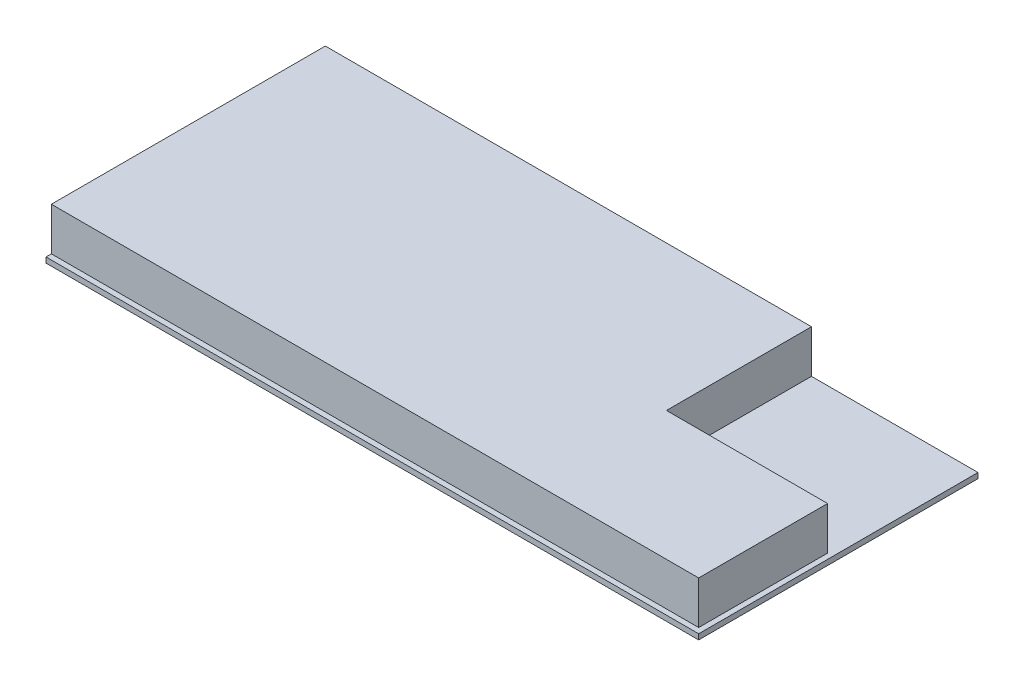
ISO-10303-21;
HEADER;
FILE_DESCRIPTION(('STEP AP214'),'2;1');
FILE_NAME('part.step','',(''),(''),'','','');
FILE_SCHEMA(('AUTOMOTIVE_DESIGN { 1 0 10303 214 1 1 1 1 }'));
ENDSEC;
DATA;
#1=APPLICATION_CONTEXT('core data for automotive mechanical design processes');
#2=APPLICATION_PROTOCOL_DEFINITION('international standard','automotive_design',2000,#1);
#3=PRODUCT_CONTEXT('',#1,'mechanical');
#4=PRODUCT('Part','Part','',(#3));
#5=PRODUCT_RELATED_PRODUCT_CATEGORY('part','',(#4));
#6=PRODUCT_DEFINITION_FORMATION('','',#4);
#7=PRODUCT_DEFINITION_CONTEXT('part definition',#1,'design');
#8=PRODUCT_DEFINITION('design','',#6,#7);
#9=PRODUCT_DEFINITION_SHAPE('','',#8);
#10=(LENGTH_UNIT() NAMED_UNIT(*) SI_UNIT(.MILLI.,.METRE.));
#11=(NAMED_UNIT(*) PLANE_ANGLE_UNIT() SI_UNIT($,.RADIAN.));
#12=(NAMED_UNIT(*) SI_UNIT($,.STERADIAN.) SOLID_ANGLE_UNIT());
#13=UNCERTAINTY_MEASURE_WITH_UNIT(LENGTH_MEASURE(1.E-05),#10,'distance_accuracy_value','');
#14=(GEOMETRIC_REPRESENTATION_CONTEXT(3) GLOBAL_UNCERTAINTY_ASSIGNED_CONTEXT((#13)) GLOBAL_UNIT_ASSIGNED_CONTEXT((#10,
#11,#12)) REPRESENTATION_CONTEXT('',''));
#15=CARTESIAN_POINT('',(0.,0.,0.));
#16=DIRECTION('',(0.,0.,1.));
#17=DIRECTION('',(1.,0.,0.));
#18=AXIS2_PLACEMENT_3D('',#15,#16,#17);
#19=CARTESIAN_POINT('',(0.,50.,0.));
#20=DIRECTION('',(0.,-1.,0.));
#21=DIRECTION('',(0.,0.,-1.));
#22=AXIS2_PLACEMENT_3D('',#19,#20,#21);
#23=PLANE('',#22);
#24=DIRECTION('',(1.,0.,0.));
#25=VECTOR('',#24,1.);
#26=CARTESIAN_POINT('',(0.,50.,1250.));
#27=LINE('',#26,#25);
#28=CARTESIAN_POINT('',(0.,50.,1250.));
#29=VERTEX_POINT('',#28);
#30=CARTESIAN_POINT('',(6025.,50.,1250.));
#31=VERTEX_POINT('',#30);
#32=EDGE_CURVE('E62',#29,#31,#27,.T.);
#33=ORIENTED_EDGE('',*,*,#32,.F.);
#34=DIRECTION('',(0.,0.,1.));
#35=VECTOR('',#34,1.);
#36=CARTESIAN_POINT('',(0.,50.,0.));
#37=LINE('',#36,#35);
#38=CARTESIAN_POINT('',(0.,50.,1300.));
#39=VERTEX_POINT('',#38);
#40=EDGE_CURVE('E174',#29,#39,#37,.T.);
#41=ORIENTED_EDGE('',*,*,#40,.T.);
#42=DIRECTION('',(1.,0.,0.));
#43=VECTOR('',#42,1.);
#44=CARTESIAN_POINT('',(-6075.,50.,1300.));
#45=LINE('',#44,#43);
#46=CARTESIAN_POINT('',(6075.,50.,1300.));
#47=VERTEX_POINT('',#46);
#48=EDGE_CURVE('E47',#39,#47,#45,.T.);
#49=ORIENTED_EDGE('',*,*,#48,.T.);
#50=DIRECTION('',(0.,0.,1.));
#51=VECTOR('',#50,1.);
#52=CARTESIAN_POINT('',(6075.,50.,1300.));
#53=LINE('',#52,#51);
#54=CARTESIAN_POINT('',(6075.,50.,-1300.));
#55=VERTEX_POINT('',#54);
#56=EDGE_CURVE('E150',#55,#47,#53,.T.);
#57=ORIENTED_EDGE('',*,*,#56,.F.);
#58=DIRECTION('',(1.,0.,0.));
#59=VECTOR('',#58,1.);
#60=CARTESIAN_POINT('',(6075.,50.,-1300.));
#61=LINE('',#60,#59);
#62=CARTESIAN_POINT('',(4525.,50.,-1300.));
#63=VERTEX_POINT('',#62);
#64=EDGE_CURVE('E149',#63,#55,#61,.T.);
#65=ORIENTED_EDGE('',*,*,#64,.F.);
#66=DIRECTION('',(0.,0.,1.));
#67=VECTOR('',#66,1.);
#68=CARTESIAN_POINT('',(4525.,50.,50.));
#69=LINE('',#68,#67);
#70=CARTESIAN_POINT('',(4525.,50.,50.));
#71=VERTEX_POINT('',#70);
#72=EDGE_CURVE('E168',#63,#71,#69,.T.);
#73=ORIENTED_EDGE('',*,*,#72,.T.);
#74=DIRECTION('',(1.,0.,0.));
#75=VECTOR('',#74,1.);
#76=CARTESIAN_POINT('',(6025.,50.,50.));
#77=LINE('',#76,#75);
#78=CARTESIAN_POINT('',(6025.,50.,50.));
#79=VERTEX_POINT('',#78);
#80=EDGE_CURVE('E170',#71,#79,#77,.T.);
#81=ORIENTED_EDGE('',*,*,#80,.T.);
#82=DIRECTION('',(0.,0.,1.));
#83=VECTOR('',#82,1.);
#84=CARTESIAN_POINT('',(6025.,50.,1250.));
#85=LINE('',#84,#83);
#86=EDGE_CURVE('E162',#79,#31,#85,.T.);
#87=ORIENTED_EDGE('',*,*,#86,.T.);
#88=EDGE_LOOP('',(#33,#41,#49,#57,#65,#73,#81,#87));
#89=FACE_BOUND('',#88,.T.);
#90=ADVANCED_FACE('F41',(#89),#23,.F.);
#91=CARTESIAN_POINT('',(-6075.,50.,-1300.));
#92=DIRECTION('',(0.,0.,1.));
#93=DIRECTION('',(1.,0.,0.));
#94=AXIS2_PLACEMENT_3D('',#91,#92,#93);
#95=PLANE('',#94);
#96=DIRECTION('',(-1.,0.,0.));
#97=VECTOR('',#96,1.);
#98=CARTESIAN_POINT('',(-6075.,0.,-1300.));
#99=LINE('',#98,#97);
#100=CARTESIAN_POINT('',(6075.,0.,-1300.));
#101=VERTEX_POINT('',#100);
#102=CARTESIAN_POINT('',(0.,0.,-1300.));
#103=VERTEX_POINT('',#102);
#104=EDGE_CURVE('E132',#101,#103,#99,.T.);
#105=ORIENTED_EDGE('',*,*,#104,.T.);
#106=DIRECTION('',(0.,1.,0.));
#107=VECTOR('',#106,1.);
#108=CARTESIAN_POINT('',(0.,0.,-1300.));
#109=LINE('',#108,#107);
#110=CARTESIAN_POINT('',(0.,450.,-1300.));
#111=VERTEX_POINT('',#110);
#112=EDGE_CURVE('E116',#103,#111,#109,.T.);
#113=ORIENTED_EDGE('',*,*,#112,.T.);
#114=DIRECTION('',(-1.,0.,0.));
#115=VECTOR('',#114,1.);
#116=CARTESIAN_POINT('',(-4525.,450.,-1300.));
#117=LINE('',#116,#115);
#118=CARTESIAN_POINT('',(4525.,450.,-1300.));
#119=VERTEX_POINT('',#118);
#120=EDGE_CURVE('E139',#119,#111,#117,.T.);
#121=ORIENTED_EDGE('',*,*,#120,.F.);
#122=DIRECTION('',(0.,-1.,0.));
#123=VECTOR('',#122,1.);
#124=CARTESIAN_POINT('',(4525.,450.,-1300.));
#125=LINE('',#124,#123);
#126=EDGE_CURVE('E147',#119,#63,#125,.T.);
#127=ORIENTED_EDGE('',*,*,#126,.T.);
#128=ORIENTED_EDGE('',*,*,#64,.T.);
#129=DIRECTION('',(0.,-1.,0.));
#130=VECTOR('',#129,1.);
#131=CARTESIAN_POINT('',(6075.,50.,-1300.));
#132=LINE('',#131,#130);
#133=EDGE_CURVE('E136',#55,#101,#132,.T.);
#134=ORIENTED_EDGE('',*,*,#133,.T.);
#135=EDGE_LOOP('',(#105,#113,#121,#127,#128,#134));
#136=FACE_BOUND('',#135,.T.);
#137=ADVANCED_FACE('F43',(#136),#95,.F.);
#138=CARTESIAN_POINT('',(-6075.,50.,1300.));
#139=DIRECTION('',(0.,0.,-1.));
#140=DIRECTION('',(-1.,0.,0.));
#141=AXIS2_PLACEMENT_3D('',#138,#139,#140);
#142=PLANE('',#141);
#143=ORIENTED_EDGE('',*,*,#48,.F.);
#144=DIRECTION('',(0.,1.,0.));
#145=VECTOR('',#144,1.);
#146=CARTESIAN_POINT('',(0.,0.,1300.));
#147=LINE('',#146,#145);
#148=CARTESIAN_POINT('',(0.,0.,1300.));
#149=VERTEX_POINT('',#148);
#150=EDGE_CURVE('E114',#149,#39,#147,.T.);
#151=ORIENTED_EDGE('',*,*,#150,.F.);
#152=DIRECTION('',(1.,0.,0.));
#153=VECTOR('',#152,1.);
#154=CARTESIAN_POINT('',(-6075.,0.,1300.));
#155=LINE('',#154,#153);
#156=CARTESIAN_POINT('',(6075.,0.,1300.));
#157=VERTEX_POINT('',#156);
#158=EDGE_CURVE('E123',#149,#157,#155,.T.);
#159=ORIENTED_EDGE('',*,*,#158,.T.);
#160=DIRECTION('',(0.,-1.,0.));
#161=VECTOR('',#160,1.);
#162=CARTESIAN_POINT('',(6075.,50.,1300.));
#163=LINE('',#162,#161);
#164=EDGE_CURVE('E144',#47,#157,#163,.T.);
#165=ORIENTED_EDGE('',*,*,#164,.F.);
#166=EDGE_LOOP('',(#143,#151,#159,#165));
#167=FACE_BOUND('',#166,.T.);
#168=ADVANCED_FACE('F124',(#167),#142,.F.);
#169=CARTESIAN_POINT('',(0.,0.,0.));
#170=DIRECTION('',(0.,-1.,0.));
#171=DIRECTION('',(0.,0.,-1.));
#172=AXIS2_PLACEMENT_3D('',#169,#170,#171);
#173=PLANE('',#172);
#174=DIRECTION('',(0.,0.,-1.));
#175=VECTOR('',#174,1.);
#176=CARTESIAN_POINT('',(0.,0.,-1300.));
#177=LINE('',#176,#175);
#178=EDGE_CURVE('E109',#149,#103,#177,.T.);
#179=ORIENTED_EDGE('',*,*,#178,.T.);
#180=ORIENTED_EDGE('',*,*,#104,.F.);
#181=DIRECTION('',(0.,0.,1.));
#182=VECTOR('',#181,1.);
#183=CARTESIAN_POINT('',(6075.,0.,1300.));
#184=LINE('',#183,#182);
#185=EDGE_CURVE('E131',#101,#157,#184,.T.);
#186=ORIENTED_EDGE('',*,*,#185,.T.);
#187=ORIENTED_EDGE('',*,*,#158,.F.);
#188=EDGE_LOOP('',(#179,#180,#186,#187));
#189=FACE_BOUND('',#188,.T.);
#190=ADVANCED_FACE('F129',(#189),#173,.T.);
#191=CARTESIAN_POINT('',(0.,450.,1250.));
#192=DIRECTION('',(0.,0.,-1.));
#193=DIRECTION('',(-1.,0.,0.));
#194=AXIS2_PLACEMENT_3D('',#191,#192,#193);
#195=PLANE('',#194);
#196=DIRECTION('',(1.,0.,0.));
#197=VECTOR('',#196,1.);
#198=CARTESIAN_POINT('',(0.,450.,1250.));
#199=LINE('',#198,#197);
#200=CARTESIAN_POINT('',(0.,450.,1250.));
#201=VERTEX_POINT('',#200);
#202=CARTESIAN_POINT('',(6025.,450.,1250.));
#203=VERTEX_POINT('',#202);
#204=EDGE_CURVE('E133',#201,#203,#199,.T.);
#205=ORIENTED_EDGE('',*,*,#204,.F.);
#206=DIRECTION('',(0.,-1.,0.));
#207=VECTOR('',#206,1.);
#208=CARTESIAN_POINT('',(0.,450.,1250.));
#209=LINE('',#208,#207);
#210=EDGE_CURVE('E57',#201,#29,#209,.T.);
#211=ORIENTED_EDGE('',*,*,#210,.T.);
#212=ORIENTED_EDGE('',*,*,#32,.T.);
#213=DIRECTION('',(0.,-1.,0.));
#214=VECTOR('',#213,1.);
#215=CARTESIAN_POINT('',(6025.,450.,1250.));
#216=LINE('',#215,#214);
#217=EDGE_CURVE('E159',#203,#31,#216,.T.);
#218=ORIENTED_EDGE('',*,*,#217,.F.);
#219=EDGE_LOOP('',(#205,#211,#212,#218));
#220=FACE_BOUND('',#219,.T.);
#221=ADVANCED_FACE('F206',(#220),#195,.F.);
#222=CARTESIAN_POINT('',(0.,450.,0.));
#223=DIRECTION('',(0.,-1.,0.));
#224=DIRECTION('',(0.,0.,-1.));
#225=AXIS2_PLACEMENT_3D('',#222,#223,#224);
#226=PLANE('',#225);
#227=ORIENTED_EDGE('',*,*,#120,.T.);
#228=DIRECTION('',(0.,0.,1.));
#229=VECTOR('',#228,1.);
#230=CARTESIAN_POINT('',(0.,450.,0.));
#231=LINE('',#230,#229);
#232=EDGE_CURVE('E11',#111,#201,#231,.T.);
#233=ORIENTED_EDGE('',*,*,#232,.T.);
#234=ORIENTED_EDGE('',*,*,#204,.T.);
#235=DIRECTION('',(0.,0.,1.));
#236=VECTOR('',#235,1.);
#237=CARTESIAN_POINT('',(6025.,450.,1250.));
#238=LINE('',#237,#236);
#239=CARTESIAN_POINT('',(6025.,450.,50.));
#240=VERTEX_POINT('',#239);
#241=EDGE_CURVE('E165',#240,#203,#238,.T.);
#242=ORIENTED_EDGE('',*,*,#241,.F.);
#243=DIRECTION('',(1.,0.,0.));
#244=VECTOR('',#243,1.);
#245=CARTESIAN_POINT('',(6025.,450.,50.));
#246=LINE('',#245,#244);
#247=CARTESIAN_POINT('',(4525.,450.,50.));
#248=VERTEX_POINT('',#247);
#249=EDGE_CURVE('E177',#248,#240,#246,.T.);
#250=ORIENTED_EDGE('',*,*,#249,.F.);
#251=DIRECTION('',(0.,0.,1.));
#252=VECTOR('',#251,1.);
#253=CARTESIAN_POINT('',(4525.,450.,50.));
#254=LINE('',#253,#252);
#255=EDGE_CURVE('E167',#119,#248,#254,.T.);
#256=ORIENTED_EDGE('',*,*,#255,.F.);
#257=EDGE_LOOP('',(#227,#233,#234,#242,#250,#256));
#258=FACE_BOUND('',#257,.T.);
#259=ADVANCED_FACE('F186',(#258),#226,.F.);
#260=CARTESIAN_POINT('',(6075.,50.,1300.));
#261=DIRECTION('',(-1.,0.,0.));
#262=DIRECTION('',(0.,0.,-1.));
#263=AXIS2_PLACEMENT_3D('',#260,#261,#262);
#264=PLANE('',#263);
#265=ORIENTED_EDGE('',*,*,#185,.F.);
#266=ORIENTED_EDGE('',*,*,#133,.F.);
#267=ORIENTED_EDGE('',*,*,#56,.T.);
#268=ORIENTED_EDGE('',*,*,#164,.T.);
#269=EDGE_LOOP('',(#265,#266,#267,#268));
#270=FACE_BOUND('',#269,.T.);
#271=ADVANCED_FACE('F197',(#270),#264,.F.);
#272=CARTESIAN_POINT('',(4525.,450.,50.));
#273=DIRECTION('',(-1.,0.,0.));
#274=DIRECTION('',(0.,0.,-1.));
#275=AXIS2_PLACEMENT_3D('',#272,#273,#274);
#276=PLANE('',#275);
#277=ORIENTED_EDGE('',*,*,#72,.F.);
#278=ORIENTED_EDGE('',*,*,#126,.F.);
#279=ORIENTED_EDGE('',*,*,#255,.T.);
#280=DIRECTION('',(0.,-1.,0.));
#281=VECTOR('',#280,1.);
#282=CARTESIAN_POINT('',(4525.,450.,50.));
#283=LINE('',#282,#281);
#284=EDGE_CURVE('E156',#248,#71,#283,.T.);
#285=ORIENTED_EDGE('',*,*,#284,.T.);
#286=EDGE_LOOP('',(#277,#278,#279,#285));
#287=FACE_BOUND('',#286,.T.);
#288=ADVANCED_FACE('F195',(#287),#276,.F.);
#289=CARTESIAN_POINT('',(6025.,450.,50.));
#290=DIRECTION('',(0.,0.,1.));
#291=DIRECTION('',(-1.,0.,0.));
#292=AXIS2_PLACEMENT_3D('',#289,#290,#291);
#293=PLANE('',#292);
#294=ORIENTED_EDGE('',*,*,#80,.F.);
#295=ORIENTED_EDGE('',*,*,#284,.F.);
#296=ORIENTED_EDGE('',*,*,#249,.T.);
#297=DIRECTION('',(0.,-1.,0.));
#298=VECTOR('',#297,1.);
#299=CARTESIAN_POINT('',(6025.,450.,50.));
#300=LINE('',#299,#298);
#301=EDGE_CURVE('E158',#240,#79,#300,.T.);
#302=ORIENTED_EDGE('',*,*,#301,.T.);
#303=EDGE_LOOP('',(#294,#295,#296,#302));
#304=FACE_BOUND('',#303,.T.);
#305=ADVANCED_FACE('F201',(#304),#293,.F.);
#306=CARTESIAN_POINT('',(6025.,450.,1250.));
#307=DIRECTION('',(-1.,0.,0.));
#308=DIRECTION('',(0.,0.,-1.));
#309=AXIS2_PLACEMENT_3D('',#306,#307,#308);
#310=PLANE('',#309);
#311=ORIENTED_EDGE('',*,*,#86,.F.);
#312=ORIENTED_EDGE('',*,*,#301,.F.);
#313=ORIENTED_EDGE('',*,*,#241,.T.);
#314=ORIENTED_EDGE('',*,*,#217,.T.);
#315=EDGE_LOOP('',(#311,#312,#313,#314));
#316=FACE_BOUND('',#315,.T.);
#317=ADVANCED_FACE('F243',(#316),#310,.F.);
#318=CARTESIAN_POINT('',(0.,0.,-1300.));
#319=DIRECTION('',(1.,0.,0.));
#320=DIRECTION('',(0.,0.,-1.));
#321=AXIS2_PLACEMENT_3D('',#318,#319,#320);
#322=PLANE('',#321);
#323=ORIENTED_EDGE('',*,*,#210,.F.);
#324=ORIENTED_EDGE('',*,*,#232,.F.);
#325=ORIENTED_EDGE('',*,*,#112,.F.);
#326=ORIENTED_EDGE('',*,*,#178,.F.);
#327=ORIENTED_EDGE('',*,*,#150,.T.);
#328=ORIENTED_EDGE('',*,*,#40,.F.);
#329=EDGE_LOOP('',(#323,#324,#325,#326,#327,#328));
#330=FACE_BOUND('',#329,.T.);
#331=ADVANCED_FACE('F115',(#330),#322,.F.);
#332=CLOSED_SHELL('',(#90,#137,#168,#190,#221,#259,#271,#288,#305,#317,#331));
#333=MANIFOLD_SOLID_BREP('B2',#332);
#334=ADVANCED_BREP_SHAPE_REPRESENTATION('',(#18,#333),#14);
#335=SHAPE_DEFINITION_REPRESENTATION(#9,#334);
ENDSEC;
END-ISO-10303-21;
